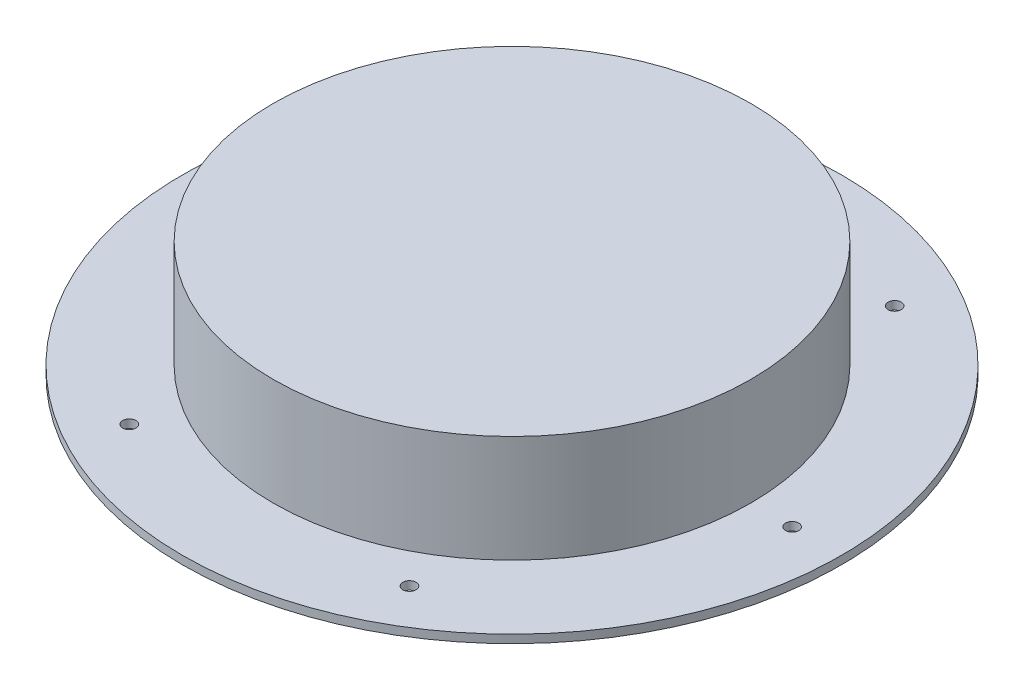
ISO-10303-21;
HEADER;
FILE_DESCRIPTION(('STEP AP214'),'2;1');
FILE_NAME('part.step','',(''),(''),'','','');
FILE_SCHEMA(('AUTOMOTIVE_DESIGN { 1 0 10303 214 1 1 1 1 }'));
ENDSEC;
DATA;
#1=APPLICATION_CONTEXT('core data for automotive mechanical design processes');
#2=APPLICATION_PROTOCOL_DEFINITION('international standard','automotive_design',2000,#1);
#3=PRODUCT_CONTEXT('',#1,'mechanical');
#4=PRODUCT('Part','Part','',(#3));
#5=PRODUCT_RELATED_PRODUCT_CATEGORY('part','',(#4));
#6=PRODUCT_DEFINITION_FORMATION('','',#4);
#7=PRODUCT_DEFINITION_CONTEXT('part definition',#1,'design');
#8=PRODUCT_DEFINITION('design','',#6,#7);
#9=PRODUCT_DEFINITION_SHAPE('','',#8);
#10=(LENGTH_UNIT() NAMED_UNIT(*) SI_UNIT(.MILLI.,.METRE.));
#11=(NAMED_UNIT(*) PLANE_ANGLE_UNIT() SI_UNIT($,.RADIAN.));
#12=(NAMED_UNIT(*) SI_UNIT($,.STERADIAN.) SOLID_ANGLE_UNIT());
#13=UNCERTAINTY_MEASURE_WITH_UNIT(LENGTH_MEASURE(1.E-05),#10,'distance_accuracy_value','');
#14=(GEOMETRIC_REPRESENTATION_CONTEXT(3) GLOBAL_UNCERTAINTY_ASSIGNED_CONTEXT((#13)) GLOBAL_UNIT_ASSIGNED_CONTEXT((#10,
#11,#12)) REPRESENTATION_CONTEXT('',''));
#15=CARTESIAN_POINT('',(0.,0.,0.));
#16=DIRECTION('',(0.,0.,1.));
#17=DIRECTION('',(1.,0.,0.));
#18=AXIS2_PLACEMENT_3D('',#15,#16,#17);
#19=CARTESIAN_POINT('',(0.,2.5,0.));
#20=DIRECTION('',(0.,1.,0.));
#21=DIRECTION('',(0.,0.,1.));
#22=AXIS2_PLACEMENT_3D('',#19,#20,#21);
#23=PLANE('',#22);
#24=CARTESIAN_POINT('',(85.,2.5,0.));
#25=DIRECTION('',(0.,1.,0.));
#26=DIRECTION('',(0.,0.,1.));
#27=AXIS2_PLACEMENT_3D('',#24,#25,#26);
#28=CIRCLE('',#27,2.);
#29=CARTESIAN_POINT('',(85.,2.5,2.));
#30=VERTEX_POINT('',#29);
#31=EDGE_CURVE('E158',#30,#30,#28,.T.);
#32=ORIENTED_EDGE('',*,*,#31,.F.);
#33=EDGE_LOOP('',(#32));
#34=FACE_BOUND('',#33,.T.);
#35=CARTESIAN_POINT('',(42.5000000000009,2.5,-73.6121593216768));
#36=DIRECTION('',(0.,1.,0.));
#37=DIRECTION('',(0.,0.,1.));
#38=AXIS2_PLACEMENT_3D('',#35,#36,#37);
#39=CIRCLE('',#38,1.99999999999999);
#40=CARTESIAN_POINT('',(42.5000000000009,2.5,-71.6121593216768));
#41=VERTEX_POINT('',#40);
#42=EDGE_CURVE('E319',#41,#41,#39,.T.);
#43=ORIENTED_EDGE('',*,*,#42,.F.);
#44=EDGE_LOOP('',(#43));
#45=FACE_BOUND('',#44,.T.);
#46=CARTESIAN_POINT('',(42.4999999999998,2.5,73.6121593216774));
#47=DIRECTION('',(0.,1.,0.));
#48=DIRECTION('',(0.,0.,1.));
#49=AXIS2_PLACEMENT_3D('',#46,#47,#48);
#50=CIRCLE('',#49,1.99999999999999);
#51=CARTESIAN_POINT('',(42.4999999999998,2.5,75.6121593216774));
#52=VERTEX_POINT('',#51);
#53=EDGE_CURVE('E316',#52,#52,#50,.T.);
#54=ORIENTED_EDGE('',*,*,#53,.F.);
#55=EDGE_LOOP('',(#54));
#56=FACE_BOUND('',#55,.T.);
#57=CARTESIAN_POINT('',(-42.5000000000003,2.5,73.6121593216771));
#58=DIRECTION('',(0.,1.,0.));
#59=DIRECTION('',(0.,0.,1.));
#60=AXIS2_PLACEMENT_3D('',#57,#58,#59);
#61=CIRCLE('',#60,1.99999999999999);
#62=CARTESIAN_POINT('',(-42.5000000000003,2.5,75.6121593216771));
#63=VERTEX_POINT('',#62);
#64=EDGE_CURVE('E307',#63,#63,#61,.T.);
#65=ORIENTED_EDGE('',*,*,#64,.F.);
#66=EDGE_LOOP('',(#65));
#67=FACE_BOUND('',#66,.T.);
#68=CARTESIAN_POINT('',(-42.4999999999993,2.5,-73.6121593216777));
#69=DIRECTION('',(0.,1.,0.));
#70=DIRECTION('',(0.,0.,1.));
#71=AXIS2_PLACEMENT_3D('',#68,#69,#70);
#72=CIRCLE('',#71,2.);
#73=CARTESIAN_POINT('',(-42.4999999999993,2.5,-71.6121593216777));
#74=VERTEX_POINT('',#73);
#75=EDGE_CURVE('E301',#74,#74,#72,.T.);
#76=ORIENTED_EDGE('',*,*,#75,.F.);
#77=EDGE_LOOP('',(#76));
#78=FACE_BOUND('',#77,.T.);
#79=CARTESIAN_POINT('',(-85.,2.5,-5.93551827603333E-13));
#80=DIRECTION('',(0.,1.,0.));
#81=DIRECTION('',(0.,0.,1.));
#82=AXIS2_PLACEMENT_3D('',#79,#80,#81);
#83=CIRCLE('',#82,1.99999999999999);
#84=CARTESIAN_POINT('',(-85.,2.5,1.9999999999994));
#85=VERTEX_POINT('',#84);
#86=EDGE_CURVE('E296',#85,#85,#83,.T.);
#87=ORIENTED_EDGE('',*,*,#86,.F.);
#88=EDGE_LOOP('',(#87));
#89=FACE_BOUND('',#88,.T.);
#90=CARTESIAN_POINT('',(0.,2.5,0.));
#91=DIRECTION('',(0.,1.,0.));
#92=DIRECTION('',(0.,0.,1.));
#93=AXIS2_PLACEMENT_3D('',#90,#91,#92);
#94=CIRCLE('',#93,100.);
#95=CARTESIAN_POINT('',(0.,2.5,100.));
#96=VERTEX_POINT('',#95);
#97=EDGE_CURVE('E11',#96,#96,#94,.T.);
#98=ORIENTED_EDGE('',*,*,#97,.T.);
#99=EDGE_LOOP('',(#98));
#100=FACE_BOUND('',#99,.T.);
#101=CARTESIAN_POINT('',(0.,2.5,0.));
#102=DIRECTION('',(0.,1.,0.));
#103=DIRECTION('',(0.,0.,1.));
#104=AXIS2_PLACEMENT_3D('',#101,#102,#103);
#105=CIRCLE('',#104,72.5);
#106=CARTESIAN_POINT('',(0.,2.5,72.5));
#107=VERTEX_POINT('',#106);
#108=EDGE_CURVE('E261',#107,#107,#105,.T.);
#109=ORIENTED_EDGE('',*,*,#108,.F.);
#110=EDGE_LOOP('',(#109));
#111=FACE_BOUND('',#110,.T.);
#112=ADVANCED_FACE('F45',(#34,#45,#56,#67,#78,#89,#100,#111),#23,.T.);
#113=CARTESIAN_POINT('',(0.,0.,0.));
#114=DIRECTION('',(0.,1.,0.));
#115=DIRECTION('',(0.,0.,1.));
#116=AXIS2_PLACEMENT_3D('',#113,#114,#115);
#117=PLANE('',#116);
#118=CARTESIAN_POINT('',(85.,0.,0.));
#119=DIRECTION('',(0.,1.,0.));
#120=DIRECTION('',(0.,0.,1.));
#121=AXIS2_PLACEMENT_3D('',#118,#119,#120);
#122=CIRCLE('',#121,2.);
#123=CARTESIAN_POINT('',(85.,0.,2.));
#124=VERTEX_POINT('',#123);
#125=EDGE_CURVE('E278',#124,#124,#122,.T.);
#126=ORIENTED_EDGE('',*,*,#125,.T.);
#127=EDGE_LOOP('',(#126));
#128=FACE_BOUND('',#127,.T.);
#129=CARTESIAN_POINT('',(-32.4999999999995,0.,-56.2916512459888));
#130=DIRECTION('',(0.,1.,0.));
#131=DIRECTION('',(0.,0.,1.));
#132=AXIS2_PLACEMENT_3D('',#129,#130,#131);
#133=CIRCLE('',#132,2.);
#134=CARTESIAN_POINT('',(-32.4999999999995,0.,-54.2916512459888));
#135=VERTEX_POINT('',#134);
#136=EDGE_CURVE('E383',#135,#135,#133,.T.);
#137=ORIENTED_EDGE('',*,*,#136,.T.);
#138=EDGE_LOOP('',(#137));
#139=FACE_BOUND('',#138,.T.);
#140=CARTESIAN_POINT('',(42.5000000000009,0.,-73.6121593216768));
#141=DIRECTION('',(0.,1.,0.));
#142=DIRECTION('',(0.,0.,1.));
#143=AXIS2_PLACEMENT_3D('',#140,#141,#142);
#144=CIRCLE('',#143,1.99999999999999);
#145=CARTESIAN_POINT('',(42.5000000000009,0.,-71.6121593216768));
#146=VERTEX_POINT('',#145);
#147=EDGE_CURVE('E387',#146,#146,#144,.T.);
#148=ORIENTED_EDGE('',*,*,#147,.T.);
#149=EDGE_LOOP('',(#148));
#150=FACE_BOUND('',#149,.T.);
#151=CARTESIAN_POINT('',(32.5000000000007,0.,-56.2916512459881));
#152=DIRECTION('',(0.,1.,0.));
#153=DIRECTION('',(0.,0.,1.));
#154=AXIS2_PLACEMENT_3D('',#151,#152,#153);
#155=CIRCLE('',#154,1.99999999999999);
#156=CARTESIAN_POINT('',(32.5000000000007,0.,-54.2916512459882));
#157=VERTEX_POINT('',#156);
#158=EDGE_CURVE('E391',#157,#157,#155,.T.);
#159=ORIENTED_EDGE('',*,*,#158,.T.);
#160=EDGE_LOOP('',(#159));
#161=FACE_BOUND('',#160,.T.);
#162=CARTESIAN_POINT('',(65.,0.,0.));
#163=DIRECTION('',(0.,1.,0.));
#164=DIRECTION('',(0.,0.,1.));
#165=AXIS2_PLACEMENT_3D('',#162,#163,#164);
#166=CIRCLE('',#165,2.);
#167=CARTESIAN_POINT('',(65.,0.,2.));
#168=VERTEX_POINT('',#167);
#169=EDGE_CURVE('E395',#168,#168,#166,.T.);
#170=ORIENTED_EDGE('',*,*,#169,.T.);
#171=EDGE_LOOP('',(#170));
#172=FACE_BOUND('',#171,.T.);
#173=CARTESIAN_POINT('',(42.4999999999998,0.,73.6121593216774));
#174=DIRECTION('',(0.,1.,0.));
#175=DIRECTION('',(0.,0.,1.));
#176=AXIS2_PLACEMENT_3D('',#173,#174,#175);
#177=CIRCLE('',#176,1.99999999999999);
#178=CARTESIAN_POINT('',(42.4999999999998,0.,75.6121593216774));
#179=VERTEX_POINT('',#178);
#180=EDGE_CURVE('E399',#179,#179,#177,.T.);
#181=ORIENTED_EDGE('',*,*,#180,.T.);
#182=EDGE_LOOP('',(#181));
#183=FACE_BOUND('',#182,.T.);
#184=CARTESIAN_POINT('',(32.4999999999999,0.,56.2916512459886));
#185=DIRECTION('',(0.,1.,0.));
#186=DIRECTION('',(0.,0.,1.));
#187=AXIS2_PLACEMENT_3D('',#184,#185,#186);
#188=CIRCLE('',#187,2.);
#189=CARTESIAN_POINT('',(32.4999999999999,0.,58.2916512459886));
#190=VERTEX_POINT('',#189);
#191=EDGE_CURVE('E403',#190,#190,#188,.T.);
#192=ORIENTED_EDGE('',*,*,#191,.T.);
#193=EDGE_LOOP('',(#192));
#194=FACE_BOUND('',#193,.T.);
#195=CARTESIAN_POINT('',(-42.5000000000003,0.,73.6121593216771));
#196=DIRECTION('',(0.,1.,0.));
#197=DIRECTION('',(0.,0.,1.));
#198=AXIS2_PLACEMENT_3D('',#195,#196,#197);
#199=CIRCLE('',#198,1.99999999999999);
#200=CARTESIAN_POINT('',(-42.5000000000003,0.,75.6121593216771));
#201=VERTEX_POINT('',#200);
#202=EDGE_CURVE('E310',#201,#201,#199,.T.);
#203=ORIENTED_EDGE('',*,*,#202,.T.);
#204=EDGE_LOOP('',(#203));
#205=FACE_BOUND('',#204,.T.);
#206=CARTESIAN_POINT('',(-42.4999999999993,0.,-73.6121593216777));
#207=DIRECTION('',(0.,1.,0.));
#208=DIRECTION('',(0.,0.,1.));
#209=AXIS2_PLACEMENT_3D('',#206,#207,#208);
#210=CIRCLE('',#209,2.);
#211=CARTESIAN_POINT('',(-42.4999999999993,0.,-71.6121593216777));
#212=VERTEX_POINT('',#211);
#213=EDGE_CURVE('E410',#212,#212,#210,.T.);
#214=ORIENTED_EDGE('',*,*,#213,.T.);
#215=EDGE_LOOP('',(#214));
#216=FACE_BOUND('',#215,.T.);
#217=CARTESIAN_POINT('',(-65.,0.,-4.53892574049607E-13));
#218=DIRECTION('',(0.,1.,0.));
#219=DIRECTION('',(0.,0.,1.));
#220=AXIS2_PLACEMENT_3D('',#217,#218,#219);
#221=CIRCLE('',#220,1.99999999999999);
#222=CARTESIAN_POINT('',(-65.,0.,1.99999999999954));
#223=VERTEX_POINT('',#222);
#224=EDGE_CURVE('E414',#223,#223,#221,.T.);
#225=ORIENTED_EDGE('',*,*,#224,.T.);
#226=EDGE_LOOP('',(#225));
#227=FACE_BOUND('',#226,.T.);
#228=CARTESIAN_POINT('',(-85.,0.,-5.93551827603333E-13));
#229=DIRECTION('',(0.,1.,0.));
#230=DIRECTION('',(0.,0.,1.));
#231=AXIS2_PLACEMENT_3D('',#228,#229,#230);
#232=CIRCLE('',#231,1.99999999999999);
#233=CARTESIAN_POINT('',(-85.,0.,1.9999999999994));
#234=VERTEX_POINT('',#233);
#235=EDGE_CURVE('E418',#234,#234,#232,.T.);
#236=ORIENTED_EDGE('',*,*,#235,.T.);
#237=EDGE_LOOP('',(#236));
#238=FACE_BOUND('',#237,.T.);
#239=CARTESIAN_POINT('',(-32.5000000000003,0.,56.2916512459884));
#240=DIRECTION('',(0.,1.,0.));
#241=DIRECTION('',(0.,0.,1.));
#242=AXIS2_PLACEMENT_3D('',#239,#240,#241);
#243=CIRCLE('',#242,2.);
#244=CARTESIAN_POINT('',(-32.5000000000003,0.,58.2916512459884));
#245=VERTEX_POINT('',#244);
#246=EDGE_CURVE('E422',#245,#245,#243,.T.);
#247=ORIENTED_EDGE('',*,*,#246,.T.);
#248=EDGE_LOOP('',(#247));
#249=FACE_BOUND('',#248,.T.);
#250=CARTESIAN_POINT('',(0.,0.,0.));
#251=DIRECTION('',(0.,1.,0.));
#252=DIRECTION('',(0.,0.,1.));
#253=AXIS2_PLACEMENT_3D('',#250,#251,#252);
#254=CIRCLE('',#253,100.);
#255=CARTESIAN_POINT('',(0.,0.,100.));
#256=VERTEX_POINT('',#255);
#257=EDGE_CURVE('E55',#256,#256,#254,.T.);
#258=ORIENTED_EDGE('',*,*,#257,.F.);
#259=EDGE_LOOP('',(#258));
#260=FACE_BOUND('',#259,.T.);
#261=CARTESIAN_POINT('',(0.,0.,0.));
#262=DIRECTION('',(0.,1.,0.));
#263=DIRECTION('',(0.,0.,1.));
#264=AXIS2_PLACEMENT_3D('',#261,#262,#263);
#265=CIRCLE('',#264,70.);
#266=CARTESIAN_POINT('',(69.2857142857143,0.,-9.97445717412062));
#267=VERTEX_POINT('',#266);
#268=CARTESIAN_POINT('',(43.2809904446054,0.,-55.0159601037188));
#269=VERTEX_POINT('',#268);
#270=EDGE_CURVE('E266',#267,#269,#265,.T.);
#271=ORIENTED_EDGE('',*,*,#270,.T.);
#272=CARTESIAN_POINT('',(34.9999999999999,0.,-60.6217782649108));
#273=DIRECTION('',(0.,-1.,0.));
#274=DIRECTION('',(0.,0.,-1.));
#275=AXIS2_PLACEMENT_3D('',#272,#273,#274);
#276=CIRCLE('',#275,9.99999999999995);
#277=CARTESIAN_POINT('',(26.0047238411086,0.,-64.9904172778393));
#278=VERTEX_POINT('',#277);
#279=EDGE_CURVE('E63',#269,#278,#276,.T.);
#280=ORIENTED_EDGE('',*,*,#279,.T.);
#281=CARTESIAN_POINT('',(-26.0047238411091,0.,-64.9904172778392));
#282=VERTEX_POINT('',#281);
#283=EDGE_CURVE('E268',#278,#282,#265,.T.);
#284=ORIENTED_EDGE('',*,*,#283,.T.);
#285=CARTESIAN_POINT('',(-35.0000000000003,0.,-60.6217782649106));
#286=DIRECTION('',(0.,-1.,0.));
#287=DIRECTION('',(0.,0.,-1.));
#288=AXIS2_PLACEMENT_3D('',#285,#286,#287);
#289=CIRCLE('',#288,9.99999999999995);
#290=CARTESIAN_POINT('',(-43.2809904446058,0.,-55.0159601037185));
#291=VERTEX_POINT('',#290);
#292=EDGE_CURVE('E69',#282,#291,#289,.T.);
#293=ORIENTED_EDGE('',*,*,#292,.T.);
#294=CARTESIAN_POINT('',(-69.2857142857144,0.,-9.97445717412014));
#295=VERTEX_POINT('',#294);
#296=EDGE_CURVE('E746',#291,#295,#265,.T.);
#297=ORIENTED_EDGE('',*,*,#296,.T.);
#298=CARTESIAN_POINT('',(-70.,0.,4.88807387438039E-13));
#299=DIRECTION('',(0.,-1.,0.));
#300=DIRECTION('',(0.,0.,-1.));
#301=AXIS2_PLACEMENT_3D('',#298,#299,#300);
#302=CIRCLE('',#301,9.99999999999995);
#303=CARTESIAN_POINT('',(-69.2857142857142,0.,9.9744571741211));
#304=VERTEX_POINT('',#303);
#305=EDGE_CURVE('E178',#295,#304,#302,.T.);
#306=ORIENTED_EDGE('',*,*,#305,.T.);
#307=CARTESIAN_POINT('',(-43.2809904446051,0.,55.0159601037191));
#308=VERTEX_POINT('',#307);
#309=EDGE_CURVE('E750',#304,#308,#265,.T.);
#310=ORIENTED_EDGE('',*,*,#309,.T.);
#311=CARTESIAN_POINT('',(-34.9999999999995,0.,60.621778264911));
#312=DIRECTION('',(0.,-1.,0.));
#313=DIRECTION('',(0.,0.,-1.));
#314=AXIS2_PLACEMENT_3D('',#311,#312,#313);
#315=CIRCLE('',#314,9.99999999999995);
#316=CARTESIAN_POINT('',(-26.0047238411082,0.,64.9904172778395));
#317=VERTEX_POINT('',#316);
#318=EDGE_CURVE('E196',#308,#317,#315,.T.);
#319=ORIENTED_EDGE('',*,*,#318,.T.);
#320=CARTESIAN_POINT('',(26.0047238411095,0.,64.990417277839));
#321=VERTEX_POINT('',#320);
#322=EDGE_CURVE('E753',#317,#321,#265,.T.);
#323=ORIENTED_EDGE('',*,*,#322,.T.);
#324=CARTESIAN_POINT('',(35.0000000000007,0.,60.6217782649103));
#325=DIRECTION('',(0.,-1.,0.));
#326=DIRECTION('',(0.,0.,-1.));
#327=AXIS2_PLACEMENT_3D('',#324,#325,#326);
#328=CIRCLE('',#327,9.99999999999995);
#329=CARTESIAN_POINT('',(43.2809904446062,0.,55.0159601037182));
#330=VERTEX_POINT('',#329);
#331=EDGE_CURVE('E214',#321,#330,#328,.T.);
#332=ORIENTED_EDGE('',*,*,#331,.T.);
#333=CARTESIAN_POINT('',(69.2857142857143,0.,9.97445717412062));
#334=VERTEX_POINT('',#333);
#335=EDGE_CURVE('E265',#330,#334,#265,.T.);
#336=ORIENTED_EDGE('',*,*,#335,.T.);
#337=CARTESIAN_POINT('',(70.,0.,0.));
#338=DIRECTION('',(0.,-1.,0.));
#339=DIRECTION('',(0.,0.,-1.));
#340=AXIS2_PLACEMENT_3D('',#337,#338,#339);
#341=CIRCLE('',#340,9.99999999999995);
#342=EDGE_CURVE('E232',#334,#267,#341,.T.);
#343=ORIENTED_EDGE('',*,*,#342,.T.);
#344=EDGE_LOOP('',(#271,#280,#284,#293,#297,#306,#310,#319,#323,#332,#336,#343));
#345=FACE_BOUND('',#344,.T.);
#346=ADVANCED_FACE('F333',(#128,#139,#150,#161,#172,#183,#194,#205,#216,#227,#238,#249,#260,
#345),#117,.F.);
#347=CARTESIAN_POINT('',(0.,2.5,0.));
#348=DIRECTION('',(0.,-1.,0.));
#349=DIRECTION('',(0.,0.,-1.));
#350=AXIS2_PLACEMENT_3D('',#347,#348,#349);
#351=CYLINDRICAL_SURFACE('',#350,100.);
#352=ORIENTED_EDGE('',*,*,#97,.F.);
#353=EDGE_LOOP('',(#352));
#354=FACE_BOUND('',#353,.T.);
#355=ORIENTED_EDGE('',*,*,#257,.T.);
#356=EDGE_LOOP('',(#355));
#357=FACE_BOUND('',#356,.T.);
#358=ADVANCED_FACE('F47',(#354,#357),#351,.T.);
#359=CARTESIAN_POINT('',(0.,2.5,0.));
#360=DIRECTION('',(0.,-1.,0.));
#361=DIRECTION('',(0.,0.,-1.));
#362=AXIS2_PLACEMENT_3D('',#359,#360,#361);
#363=CYLINDRICAL_SURFACE('',#362,70.);
#364=DIRECTION('',(0.,-1.,0.));
#365=VECTOR('',#364,1.);
#366=CARTESIAN_POINT('',(43.2809904446054,5.,-55.0159601037188));
#367=LINE('',#366,#365);
#368=CARTESIAN_POINT('',(43.2809904446054,5.,-55.0159601037188));
#369=VERTEX_POINT('',#368);
#370=EDGE_CURVE('E136',#369,#269,#367,.T.);
#371=ORIENTED_EDGE('',*,*,#370,.T.);
#372=ORIENTED_EDGE('',*,*,#270,.F.);
#373=DIRECTION('',(0.,-1.,0.));
#374=VECTOR('',#373,1.);
#375=CARTESIAN_POINT('',(69.2857142857143,5.,-9.97445717412062));
#376=LINE('',#375,#374);
#377=CARTESIAN_POINT('',(69.2857142857143,5.,-9.97445717412062));
#378=VERTEX_POINT('',#377);
#379=EDGE_CURVE('E246',#378,#267,#376,.T.);
#380=ORIENTED_EDGE('',*,*,#379,.F.);
#381=CARTESIAN_POINT('',(0.,5.,0.));
#382=DIRECTION('',(0.,-1.,0.));
#383=DIRECTION('',(0.,0.,-1.));
#384=AXIS2_PLACEMENT_3D('',#381,#382,#383);
#385=CIRCLE('',#384,70.);
#386=CARTESIAN_POINT('',(69.2857142857143,5.,9.97445717412062));
#387=VERTEX_POINT('',#386);
#388=EDGE_CURVE('E236',#387,#378,#385,.F.);
#389=ORIENTED_EDGE('',*,*,#388,.F.);
#390=DIRECTION('',(0.,-1.,0.));
#391=VECTOR('',#390,1.);
#392=CARTESIAN_POINT('',(69.2857142857143,5.,9.97445717412062));
#393=LINE('',#392,#391);
#394=EDGE_CURVE('E243',#387,#334,#393,.T.);
#395=ORIENTED_EDGE('',*,*,#394,.T.);
#396=ORIENTED_EDGE('',*,*,#335,.F.);
#397=DIRECTION('',(0.,-1.,0.));
#398=VECTOR('',#397,1.);
#399=CARTESIAN_POINT('',(43.2809904446062,5.,55.0159601037182));
#400=LINE('',#399,#398);
#401=CARTESIAN_POINT('',(43.2809904446062,5.,55.0159601037182));
#402=VERTEX_POINT('',#401);
#403=EDGE_CURVE('E228',#402,#330,#400,.T.);
#404=ORIENTED_EDGE('',*,*,#403,.F.);
#405=CARTESIAN_POINT('',(0.,5.,0.));
#406=DIRECTION('',(0.,-1.,0.));
#407=DIRECTION('',(0.,0.,-1.));
#408=AXIS2_PLACEMENT_3D('',#405,#406,#407);
#409=CIRCLE('',#408,70.);
#410=CARTESIAN_POINT('',(26.0047238411095,5.,64.990417277839));
#411=VERTEX_POINT('',#410);
#412=EDGE_CURVE('E218',#411,#402,#409,.F.);
#413=ORIENTED_EDGE('',*,*,#412,.F.);
#414=DIRECTION('',(0.,-1.,0.));
#415=VECTOR('',#414,1.);
#416=CARTESIAN_POINT('',(26.0047238411095,5.,64.990417277839));
#417=LINE('',#416,#415);
#418=EDGE_CURVE('E225',#411,#321,#417,.T.);
#419=ORIENTED_EDGE('',*,*,#418,.T.);
#420=ORIENTED_EDGE('',*,*,#322,.F.);
#421=DIRECTION('',(0.,-1.,0.));
#422=VECTOR('',#421,1.);
#423=CARTESIAN_POINT('',(-26.0047238411082,5.,64.9904172778395));
#424=LINE('',#423,#422);
#425=CARTESIAN_POINT('',(-26.0047238411082,5.,64.9904172778395));
#426=VERTEX_POINT('',#425);
#427=EDGE_CURVE('E210',#426,#317,#424,.T.);
#428=ORIENTED_EDGE('',*,*,#427,.F.);
#429=CARTESIAN_POINT('',(0.,5.,0.));
#430=DIRECTION('',(0.,-1.,0.));
#431=DIRECTION('',(0.,0.,-1.));
#432=AXIS2_PLACEMENT_3D('',#429,#430,#431);
#433=CIRCLE('',#432,70.);
#434=CARTESIAN_POINT('',(-43.2809904446051,5.,55.0159601037191));
#435=VERTEX_POINT('',#434);
#436=EDGE_CURVE('E200',#435,#426,#433,.F.);
#437=ORIENTED_EDGE('',*,*,#436,.F.);
#438=DIRECTION('',(0.,-1.,0.));
#439=VECTOR('',#438,1.);
#440=CARTESIAN_POINT('',(-43.2809904446051,5.,55.0159601037191));
#441=LINE('',#440,#439);
#442=EDGE_CURVE('E207',#435,#308,#441,.T.);
#443=ORIENTED_EDGE('',*,*,#442,.T.);
#444=ORIENTED_EDGE('',*,*,#309,.F.);
#445=DIRECTION('',(0.,-1.,0.));
#446=VECTOR('',#445,1.);
#447=CARTESIAN_POINT('',(-69.2857142857142,5.,9.9744571741211));
#448=LINE('',#447,#446);
#449=CARTESIAN_POINT('',(-69.2857142857142,5.,9.9744571741211));
#450=VERTEX_POINT('',#449);
#451=EDGE_CURVE('E192',#450,#304,#448,.T.);
#452=ORIENTED_EDGE('',*,*,#451,.F.);
#453=CARTESIAN_POINT('',(0.,5.,0.));
#454=DIRECTION('',(0.,-1.,0.));
#455=DIRECTION('',(0.,0.,-1.));
#456=AXIS2_PLACEMENT_3D('',#453,#454,#455);
#457=CIRCLE('',#456,70.);
#458=CARTESIAN_POINT('',(-69.2857142857144,5.,-9.97445717412014));
#459=VERTEX_POINT('',#458);
#460=EDGE_CURVE('E182',#459,#450,#457,.F.);
#461=ORIENTED_EDGE('',*,*,#460,.F.);
#462=DIRECTION('',(0.,-1.,0.));
#463=VECTOR('',#462,1.);
#464=CARTESIAN_POINT('',(-69.2857142857144,5.,-9.97445717412014));
#465=LINE('',#464,#463);
#466=EDGE_CURVE('E189',#459,#295,#465,.T.);
#467=ORIENTED_EDGE('',*,*,#466,.T.);
#468=ORIENTED_EDGE('',*,*,#296,.F.);
#469=DIRECTION('',(0.,-1.,0.));
#470=VECTOR('',#469,1.);
#471=CARTESIAN_POINT('',(-43.2809904446058,5.,-55.0159601037185));
#472=LINE('',#471,#470);
#473=CARTESIAN_POINT('',(-43.2809904446058,5.,-55.0159601037185));
#474=VERTEX_POINT('',#473);
#475=EDGE_CURVE('E175',#474,#291,#472,.T.);
#476=ORIENTED_EDGE('',*,*,#475,.F.);
#477=CARTESIAN_POINT('',(0.,5.,0.));
#478=DIRECTION('',(0.,-1.,0.));
#479=DIRECTION('',(0.,0.,-1.));
#480=AXIS2_PLACEMENT_3D('',#477,#478,#479);
#481=CIRCLE('',#480,70.);
#482=CARTESIAN_POINT('',(-26.0047238411091,5.,-64.9904172778392));
#483=VERTEX_POINT('',#482);
#484=EDGE_CURVE('E165',#483,#474,#481,.F.);
#485=ORIENTED_EDGE('',*,*,#484,.F.);
#486=DIRECTION('',(0.,-1.,0.));
#487=VECTOR('',#486,1.);
#488=CARTESIAN_POINT('',(-26.0047238411091,5.,-64.9904172778392));
#489=LINE('',#488,#487);
#490=EDGE_CURVE('E172',#483,#282,#489,.T.);
#491=ORIENTED_EDGE('',*,*,#490,.T.);
#492=ORIENTED_EDGE('',*,*,#283,.F.);
#493=DIRECTION('',(0.,-1.,0.));
#494=VECTOR('',#493,1.);
#495=CARTESIAN_POINT('',(26.0047238411086,5.,-64.9904172778393));
#496=LINE('',#495,#494);
#497=CARTESIAN_POINT('',(26.0047238411086,5.,-64.9904172778393));
#498=VERTEX_POINT('',#497);
#499=EDGE_CURVE('E145',#498,#278,#496,.T.);
#500=ORIENTED_EDGE('',*,*,#499,.F.);
#501=CARTESIAN_POINT('',(0.,5.,0.));
#502=DIRECTION('',(0.,-1.,0.));
#503=DIRECTION('',(0.,0.,-1.));
#504=AXIS2_PLACEMENT_3D('',#501,#502,#503);
#505=CIRCLE('',#504,70.);
#506=EDGE_CURVE('E149',#369,#498,#505,.F.);
#507=ORIENTED_EDGE('',*,*,#506,.F.);
#508=EDGE_LOOP('',(#371,#372,#380,#389,#395,#396,#404,#413,#419,#420,#428,#437,#443,#444,#452,
#461,#467,#468,#476,#485,#491,#492,#500,#507));
#509=FACE_BOUND('',#508,.T.);
#510=CARTESIAN_POINT('',(0.,32.5,0.));
#511=DIRECTION('',(0.,1.,0.));
#512=DIRECTION('',(0.,0.,1.));
#513=AXIS2_PLACEMENT_3D('',#510,#511,#512);
#514=CIRCLE('',#513,70.);
#515=CARTESIAN_POINT('',(0.,32.5,70.));
#516=VERTEX_POINT('',#515);
#517=EDGE_CURVE('E257',#516,#516,#514,.T.);
#518=ORIENTED_EDGE('',*,*,#517,.T.);
#519=EDGE_LOOP('',(#518));
#520=FACE_BOUND('',#519,.T.);
#521=ADVANCED_FACE('F152',(#509,#520),#363,.F.);
#522=CARTESIAN_POINT('',(0.,32.5,0.));
#523=DIRECTION('',(0.,-1.,0.));
#524=DIRECTION('',(0.,0.,-1.));
#525=AXIS2_PLACEMENT_3D('',#522,#523,#524);
#526=CYLINDRICAL_SURFACE('',#525,72.5);
#527=ORIENTED_EDGE('',*,*,#108,.T.);
#528=EDGE_LOOP('',(#527));
#529=FACE_BOUND('',#528,.T.);
#530=CARTESIAN_POINT('',(0.,35.,0.));
#531=DIRECTION('',(0.,1.,0.));
#532=DIRECTION('',(0.,0.,1.));
#533=AXIS2_PLACEMENT_3D('',#530,#531,#532);
#534=CIRCLE('',#533,72.5);
#535=CARTESIAN_POINT('',(0.,35.,72.5));
#536=VERTEX_POINT('',#535);
#537=EDGE_CURVE('E250',#536,#536,#534,.T.);
#538=ORIENTED_EDGE('',*,*,#537,.F.);
#539=EDGE_LOOP('',(#538));
#540=FACE_BOUND('',#539,.T.);
#541=ADVANCED_FACE('F347',(#529,#540),#526,.T.);
#542=CARTESIAN_POINT('',(0.,32.5,0.));
#543=DIRECTION('',(0.,1.,0.));
#544=DIRECTION('',(0.,0.,1.));
#545=AXIS2_PLACEMENT_3D('',#542,#543,#544);
#546=PLANE('',#545);
#547=ORIENTED_EDGE('',*,*,#517,.F.);
#548=EDGE_LOOP('',(#547));
#549=FACE_BOUND('',#548,.T.);
#550=ADVANCED_FACE('F350',(#549),#546,.F.);
#551=CARTESIAN_POINT('',(0.,35.,0.));
#552=DIRECTION('',(0.,1.,0.));
#553=DIRECTION('',(0.,0.,1.));
#554=AXIS2_PLACEMENT_3D('',#551,#552,#553);
#555=PLANE('',#554);
#556=ORIENTED_EDGE('',*,*,#537,.T.);
#557=EDGE_LOOP('',(#556));
#558=FACE_BOUND('',#557,.T.);
#559=ADVANCED_FACE('F354',(#558),#555,.T.);
#560=CARTESIAN_POINT('',(70.,5.,0.));
#561=DIRECTION('',(0.,-1.,0.));
#562=DIRECTION('',(0.,0.,-1.));
#563=AXIS2_PLACEMENT_3D('',#560,#561,#562);
#564=CYLINDRICAL_SURFACE('',#563,9.99999999999995);
#565=ORIENTED_EDGE('',*,*,#342,.F.);
#566=ORIENTED_EDGE('',*,*,#394,.F.);
#567=CARTESIAN_POINT('',(70.,5.,0.));
#568=DIRECTION('',(0.,-1.,0.));
#569=DIRECTION('',(0.,0.,-1.));
#570=AXIS2_PLACEMENT_3D('',#567,#568,#569);
#571=CIRCLE('',#570,9.99999999999995);
#572=EDGE_CURVE('E239',#387,#378,#571,.T.);
#573=ORIENTED_EDGE('',*,*,#572,.T.);
#574=ORIENTED_EDGE('',*,*,#379,.T.);
#575=EDGE_LOOP('',(#565,#566,#573,#574));
#576=FACE_BOUND('',#575,.T.);
#577=ADVANCED_FACE('F356',(#576),#564,.T.);
#578=CARTESIAN_POINT('',(0.,5.,0.));
#579=DIRECTION('',(0.,-1.,0.));
#580=DIRECTION('',(0.,0.,-1.));
#581=AXIS2_PLACEMENT_3D('',#578,#579,#580);
#582=PLANE('',#581);
#583=CARTESIAN_POINT('',(65.,5.,0.));
#584=DIRECTION('',(0.,-1.,0.));
#585=DIRECTION('',(0.,0.,-1.));
#586=AXIS2_PLACEMENT_3D('',#583,#584,#585);
#587=CIRCLE('',#586,2.);
#588=CARTESIAN_POINT('',(65.,5.,-2.));
#589=VERTEX_POINT('',#588);
#590=EDGE_CURVE('E49',#589,#589,#587,.T.);
#591=ORIENTED_EDGE('',*,*,#590,.T.);
#592=EDGE_LOOP('',(#591));
#593=FACE_BOUND('',#592,.T.);
#594=ORIENTED_EDGE('',*,*,#388,.T.);
#595=ORIENTED_EDGE('',*,*,#572,.F.);
#596=EDGE_LOOP('',(#594,#595));
#597=FACE_BOUND('',#596,.T.);
#598=ADVANCED_FACE('F363',(#593,#597),#582,.F.);
#599=CARTESIAN_POINT('',(35.0000000000007,5.,60.6217782649103));
#600=DIRECTION('',(0.,-1.,0.));
#601=DIRECTION('',(0.,0.,-1.));
#602=AXIS2_PLACEMENT_3D('',#599,#600,#601);
#603=CYLINDRICAL_SURFACE('',#602,9.99999999999995);
#604=ORIENTED_EDGE('',*,*,#331,.F.);
#605=ORIENTED_EDGE('',*,*,#418,.F.);
#606=CARTESIAN_POINT('',(35.0000000000007,5.,60.6217782649103));
#607=DIRECTION('',(0.,-1.,0.));
#608=DIRECTION('',(0.,0.,-1.));
#609=AXIS2_PLACEMENT_3D('',#606,#607,#608);
#610=CIRCLE('',#609,9.99999999999995);
#611=EDGE_CURVE('E221',#411,#402,#610,.T.);
#612=ORIENTED_EDGE('',*,*,#611,.T.);
#613=ORIENTED_EDGE('',*,*,#403,.T.);
#614=EDGE_LOOP('',(#604,#605,#612,#613));
#615=FACE_BOUND('',#614,.T.);
#616=ADVANCED_FACE('F429',(#615),#603,.T.);
#617=CARTESIAN_POINT('',(0.,5.,0.));
#618=DIRECTION('',(0.,-1.,0.));
#619=DIRECTION('',(0.,0.,-1.));
#620=AXIS2_PLACEMENT_3D('',#617,#618,#619);
#621=PLANE('',#620);
#622=CARTESIAN_POINT('',(32.4999999999999,5.,56.2916512459886));
#623=DIRECTION('',(0.,-1.,0.));
#624=DIRECTION('',(0.,0.,-1.));
#625=AXIS2_PLACEMENT_3D('',#622,#623,#624);
#626=CIRCLE('',#625,2.);
#627=CARTESIAN_POINT('',(32.4999999999999,5.,54.2916512459886));
#628=VERTEX_POINT('',#627);
#629=EDGE_CURVE('E289',#628,#628,#626,.T.);
#630=ORIENTED_EDGE('',*,*,#629,.T.);
#631=EDGE_LOOP('',(#630));
#632=FACE_BOUND('',#631,.T.);
#633=ORIENTED_EDGE('',*,*,#412,.T.);
#634=ORIENTED_EDGE('',*,*,#611,.F.);
#635=EDGE_LOOP('',(#633,#634));
#636=FACE_BOUND('',#635,.T.);
#637=ADVANCED_FACE('F434',(#632,#636),#621,.F.);
#638=CARTESIAN_POINT('',(-34.9999999999995,5.,60.621778264911));
#639=DIRECTION('',(0.,-1.,0.));
#640=DIRECTION('',(0.,0.,-1.));
#641=AXIS2_PLACEMENT_3D('',#638,#639,#640);
#642=CYLINDRICAL_SURFACE('',#641,9.99999999999995);
#643=ORIENTED_EDGE('',*,*,#318,.F.);
#644=ORIENTED_EDGE('',*,*,#442,.F.);
#645=CARTESIAN_POINT('',(-34.9999999999995,5.,60.621778264911));
#646=DIRECTION('',(0.,-1.,0.));
#647=DIRECTION('',(0.,0.,-1.));
#648=AXIS2_PLACEMENT_3D('',#645,#646,#647);
#649=CIRCLE('',#648,9.99999999999995);
#650=EDGE_CURVE('E203',#435,#426,#649,.T.);
#651=ORIENTED_EDGE('',*,*,#650,.T.);
#652=ORIENTED_EDGE('',*,*,#427,.T.);
#653=EDGE_LOOP('',(#643,#644,#651,#652));
#654=FACE_BOUND('',#653,.T.);
#655=ADVANCED_FACE('F439',(#654),#642,.T.);
#656=CARTESIAN_POINT('',(0.,5.,0.));
#657=DIRECTION('',(0.,-1.,0.));
#658=DIRECTION('',(0.,0.,-1.));
#659=AXIS2_PLACEMENT_3D('',#656,#657,#658);
#660=PLANE('',#659);
#661=CARTESIAN_POINT('',(-32.5000000000003,5.,56.2916512459884));
#662=DIRECTION('',(0.,-1.,0.));
#663=DIRECTION('',(0.,0.,-1.));
#664=AXIS2_PLACEMENT_3D('',#661,#662,#663);
#665=CIRCLE('',#664,2.);
#666=CARTESIAN_POINT('',(-32.5000000000003,5.,54.2916512459884));
#667=VERTEX_POINT('',#666);
#668=EDGE_CURVE('E286',#667,#667,#665,.T.);
#669=ORIENTED_EDGE('',*,*,#668,.T.);
#670=EDGE_LOOP('',(#669));
#671=FACE_BOUND('',#670,.T.);
#672=ORIENTED_EDGE('',*,*,#436,.T.);
#673=ORIENTED_EDGE('',*,*,#650,.F.);
#674=EDGE_LOOP('',(#672,#673));
#675=FACE_BOUND('',#674,.T.);
#676=ADVANCED_FACE('F442',(#671,#675),#660,.F.);
#677=CARTESIAN_POINT('',(-70.,5.,4.88807387438039E-13));
#678=DIRECTION('',(0.,-1.,0.));
#679=DIRECTION('',(0.,0.,-1.));
#680=AXIS2_PLACEMENT_3D('',#677,#678,#679);
#681=CYLINDRICAL_SURFACE('',#680,9.99999999999995);
#682=ORIENTED_EDGE('',*,*,#305,.F.);
#683=ORIENTED_EDGE('',*,*,#466,.F.);
#684=CARTESIAN_POINT('',(-70.,5.,4.88807387438039E-13));
#685=DIRECTION('',(0.,-1.,0.));
#686=DIRECTION('',(0.,0.,-1.));
#687=AXIS2_PLACEMENT_3D('',#684,#685,#686);
#688=CIRCLE('',#687,9.99999999999995);
#689=EDGE_CURVE('E185',#459,#450,#688,.T.);
#690=ORIENTED_EDGE('',*,*,#689,.T.);
#691=ORIENTED_EDGE('',*,*,#451,.T.);
#692=EDGE_LOOP('',(#682,#683,#690,#691));
#693=FACE_BOUND('',#692,.T.);
#694=ADVANCED_FACE('F446',(#693),#681,.T.);
#695=CARTESIAN_POINT('',(0.,5.,0.));
#696=DIRECTION('',(0.,-1.,0.));
#697=DIRECTION('',(0.,0.,-1.));
#698=AXIS2_PLACEMENT_3D('',#695,#696,#697);
#699=PLANE('',#698);
#700=CARTESIAN_POINT('',(-65.,5.,-4.53892574049607E-13));
#701=DIRECTION('',(0.,-1.,0.));
#702=DIRECTION('',(0.,0.,-1.));
#703=AXIS2_PLACEMENT_3D('',#700,#701,#702);
#704=CIRCLE('',#703,1.99999999999999);
#705=CARTESIAN_POINT('',(-65.,5.,-2.00000000000045));
#706=VERTEX_POINT('',#705);
#707=EDGE_CURVE('E282',#706,#706,#704,.T.);
#708=ORIENTED_EDGE('',*,*,#707,.T.);
#709=EDGE_LOOP('',(#708));
#710=FACE_BOUND('',#709,.T.);
#711=ORIENTED_EDGE('',*,*,#460,.T.);
#712=ORIENTED_EDGE('',*,*,#689,.F.);
#713=EDGE_LOOP('',(#711,#712));
#714=FACE_BOUND('',#713,.T.);
#715=ADVANCED_FACE('F450',(#710,#714),#699,.F.);
#716=CARTESIAN_POINT('',(-35.0000000000003,5.,-60.6217782649106));
#717=DIRECTION('',(0.,-1.,0.));
#718=DIRECTION('',(0.,0.,-1.));
#719=AXIS2_PLACEMENT_3D('',#716,#717,#718);
#720=CYLINDRICAL_SURFACE('',#719,9.99999999999995);
#721=ORIENTED_EDGE('',*,*,#292,.F.);
#722=ORIENTED_EDGE('',*,*,#490,.F.);
#723=CARTESIAN_POINT('',(-35.0000000000003,5.,-60.6217782649106));
#724=DIRECTION('',(0.,-1.,0.));
#725=DIRECTION('',(0.,0.,-1.));
#726=AXIS2_PLACEMENT_3D('',#723,#724,#725);
#727=CIRCLE('',#726,9.99999999999995);
#728=EDGE_CURVE('E168',#483,#474,#727,.T.);
#729=ORIENTED_EDGE('',*,*,#728,.T.);
#730=ORIENTED_EDGE('',*,*,#475,.T.);
#731=EDGE_LOOP('',(#721,#722,#729,#730));
#732=FACE_BOUND('',#731,.T.);
#733=ADVANCED_FACE('F454',(#732),#720,.T.);
#734=CARTESIAN_POINT('',(0.,5.,0.));
#735=DIRECTION('',(0.,-1.,0.));
#736=DIRECTION('',(0.,0.,-1.));
#737=AXIS2_PLACEMENT_3D('',#734,#735,#736);
#738=PLANE('',#737);
#739=CARTESIAN_POINT('',(-32.4999999999995,5.,-56.2916512459888));
#740=DIRECTION('',(0.,-1.,0.));
#741=DIRECTION('',(0.,0.,-1.));
#742=AXIS2_PLACEMENT_3D('',#739,#740,#741);
#743=CIRCLE('',#742,2.);
#744=CARTESIAN_POINT('',(-32.4999999999995,5.,-58.2916512459888));
#745=VERTEX_POINT('',#744);
#746=EDGE_CURVE('E277',#745,#745,#743,.T.);
#747=ORIENTED_EDGE('',*,*,#746,.T.);
#748=EDGE_LOOP('',(#747));
#749=FACE_BOUND('',#748,.T.);
#750=ORIENTED_EDGE('',*,*,#484,.T.);
#751=ORIENTED_EDGE('',*,*,#728,.F.);
#752=EDGE_LOOP('',(#750,#751));
#753=FACE_BOUND('',#752,.T.);
#754=ADVANCED_FACE('F458',(#749,#753),#738,.F.);
#755=CARTESIAN_POINT('',(34.9999999999999,5.,-60.6217782649108));
#756=DIRECTION('',(0.,-1.,0.));
#757=DIRECTION('',(0.,0.,-1.));
#758=AXIS2_PLACEMENT_3D('',#755,#756,#757);
#759=CYLINDRICAL_SURFACE('',#758,9.99999999999995);
#760=ORIENTED_EDGE('',*,*,#279,.F.);
#761=ORIENTED_EDGE('',*,*,#370,.F.);
#762=CARTESIAN_POINT('',(34.9999999999999,5.,-60.6217782649108));
#763=DIRECTION('',(0.,-1.,0.));
#764=DIRECTION('',(0.,0.,-1.));
#765=AXIS2_PLACEMENT_3D('',#762,#763,#764);
#766=CIRCLE('',#765,9.99999999999995);
#767=EDGE_CURVE('E139',#369,#498,#766,.T.);
#768=ORIENTED_EDGE('',*,*,#767,.T.);
#769=ORIENTED_EDGE('',*,*,#499,.T.);
#770=EDGE_LOOP('',(#760,#761,#768,#769));
#771=FACE_BOUND('',#770,.T.);
#772=ADVANCED_FACE('F138',(#771),#759,.T.);
#773=CARTESIAN_POINT('',(0.,5.,0.));
#774=DIRECTION('',(0.,-1.,0.));
#775=DIRECTION('',(0.,0.,-1.));
#776=AXIS2_PLACEMENT_3D('',#773,#774,#775);
#777=PLANE('',#776);
#778=CARTESIAN_POINT('',(32.5000000000007,5.,-56.2916512459881));
#779=DIRECTION('',(0.,-1.,0.));
#780=DIRECTION('',(0.,0.,-1.));
#781=AXIS2_PLACEMENT_3D('',#778,#779,#780);
#782=CIRCLE('',#781,1.99999999999999);
#783=CARTESIAN_POINT('',(32.5000000000007,5.,-58.2916512459881));
#784=VERTEX_POINT('',#783);
#785=EDGE_CURVE('E273',#784,#784,#782,.T.);
#786=ORIENTED_EDGE('',*,*,#785,.T.);
#787=EDGE_LOOP('',(#786));
#788=FACE_BOUND('',#787,.T.);
#789=ORIENTED_EDGE('',*,*,#506,.T.);
#790=ORIENTED_EDGE('',*,*,#767,.F.);
#791=EDGE_LOOP('',(#789,#790));
#792=FACE_BOUND('',#791,.T.);
#793=ADVANCED_FACE('F148',(#788,#792),#777,.F.);
#794=CARTESIAN_POINT('',(32.5000000000007,0.,-56.2916512459881));
#795=DIRECTION('',(0.,1.,0.));
#796=DIRECTION('',(0.,0.,1.));
#797=AXIS2_PLACEMENT_3D('',#794,#795,#796);
#798=CYLINDRICAL_SURFACE('',#797,1.99999999999999);
#799=ORIENTED_EDGE('',*,*,#158,.F.);
#800=EDGE_LOOP('',(#799));
#801=FACE_BOUND('',#800,.T.);
#802=ORIENTED_EDGE('',*,*,#785,.F.);
#803=EDGE_LOOP('',(#802));
#804=FACE_BOUND('',#803,.T.);
#805=ADVANCED_FACE('F467',(#801,#804),#798,.F.);
#806=CARTESIAN_POINT('',(-32.4999999999995,0.,-56.2916512459888));
#807=DIRECTION('',(0.,1.,0.));
#808=DIRECTION('',(0.,0.,1.));
#809=AXIS2_PLACEMENT_3D('',#806,#807,#808);
#810=CYLINDRICAL_SURFACE('',#809,2.);
#811=ORIENTED_EDGE('',*,*,#136,.F.);
#812=EDGE_LOOP('',(#811));
#813=FACE_BOUND('',#812,.T.);
#814=ORIENTED_EDGE('',*,*,#746,.F.);
#815=EDGE_LOOP('',(#814));
#816=FACE_BOUND('',#815,.T.);
#817=ADVANCED_FACE('F500',(#813,#816),#810,.F.);
#818=CARTESIAN_POINT('',(-65.,0.,-4.53892574049607E-13));
#819=DIRECTION('',(0.,1.,0.));
#820=DIRECTION('',(0.,0.,1.));
#821=AXIS2_PLACEMENT_3D('',#818,#819,#820);
#822=CYLINDRICAL_SURFACE('',#821,1.99999999999999);
#823=ORIENTED_EDGE('',*,*,#224,.F.);
#824=EDGE_LOOP('',(#823));
#825=FACE_BOUND('',#824,.T.);
#826=ORIENTED_EDGE('',*,*,#707,.F.);
#827=EDGE_LOOP('',(#826));
#828=FACE_BOUND('',#827,.T.);
#829=ADVANCED_FACE('F493',(#825,#828),#822,.F.);
#830=CARTESIAN_POINT('',(-32.5000000000003,0.,56.2916512459884));
#831=DIRECTION('',(0.,1.,0.));
#832=DIRECTION('',(0.,0.,1.));
#833=AXIS2_PLACEMENT_3D('',#830,#831,#832);
#834=CYLINDRICAL_SURFACE('',#833,2.);
#835=ORIENTED_EDGE('',*,*,#246,.F.);
#836=EDGE_LOOP('',(#835));
#837=FACE_BOUND('',#836,.T.);
#838=ORIENTED_EDGE('',*,*,#668,.F.);
#839=EDGE_LOOP('',(#838));
#840=FACE_BOUND('',#839,.T.);
#841=ADVANCED_FACE('F479',(#837,#840),#834,.F.);
#842=CARTESIAN_POINT('',(32.4999999999999,0.,56.2916512459886));
#843=DIRECTION('',(0.,1.,0.));
#844=DIRECTION('',(0.,0.,1.));
#845=AXIS2_PLACEMENT_3D('',#842,#843,#844);
#846=CYLINDRICAL_SURFACE('',#845,2.);
#847=ORIENTED_EDGE('',*,*,#191,.F.);
#848=EDGE_LOOP('',(#847));
#849=FACE_BOUND('',#848,.T.);
#850=ORIENTED_EDGE('',*,*,#629,.F.);
#851=EDGE_LOOP('',(#850));
#852=FACE_BOUND('',#851,.T.);
#853=ADVANCED_FACE('F475',(#849,#852),#846,.F.);
#854=CARTESIAN_POINT('',(65.,0.,0.));
#855=DIRECTION('',(0.,1.,0.));
#856=DIRECTION('',(0.,0.,1.));
#857=AXIS2_PLACEMENT_3D('',#854,#855,#856);
#858=CYLINDRICAL_SURFACE('',#857,2.);
#859=ORIENTED_EDGE('',*,*,#169,.F.);
#860=EDGE_LOOP('',(#859));
#861=FACE_BOUND('',#860,.T.);
#862=ORIENTED_EDGE('',*,*,#590,.F.);
#863=EDGE_LOOP('',(#862));
#864=FACE_BOUND('',#863,.T.);
#865=ADVANCED_FACE('F478',(#861,#864),#858,.F.);
#866=CARTESIAN_POINT('',(-85.,0.,-5.93551827603333E-13));
#867=DIRECTION('',(0.,1.,0.));
#868=DIRECTION('',(0.,0.,1.));
#869=AXIS2_PLACEMENT_3D('',#866,#867,#868);
#870=CYLINDRICAL_SURFACE('',#869,1.99999999999999);
#871=ORIENTED_EDGE('',*,*,#86,.T.);
#872=EDGE_LOOP('',(#871));
#873=FACE_BOUND('',#872,.T.);
#874=ORIENTED_EDGE('',*,*,#235,.F.);
#875=EDGE_LOOP('',(#874));
#876=FACE_BOUND('',#875,.T.);
#877=ADVANCED_FACE('F487',(#873,#876),#870,.F.);
#878=CARTESIAN_POINT('',(-42.4999999999993,0.,-73.6121593216777));
#879=DIRECTION('',(0.,1.,0.));
#880=DIRECTION('',(0.,0.,1.));
#881=AXIS2_PLACEMENT_3D('',#878,#879,#880);
#882=CYLINDRICAL_SURFACE('',#881,2.);
#883=ORIENTED_EDGE('',*,*,#75,.T.);
#884=EDGE_LOOP('',(#883));
#885=FACE_BOUND('',#884,.T.);
#886=ORIENTED_EDGE('',*,*,#213,.F.);
#887=EDGE_LOOP('',(#886));
#888=FACE_BOUND('',#887,.T.);
#889=ADVANCED_FACE('F473',(#885,#888),#882,.F.);
#890=CARTESIAN_POINT('',(-42.5000000000003,0.,73.6121593216771));
#891=DIRECTION('',(0.,1.,0.));
#892=DIRECTION('',(0.,0.,1.));
#893=AXIS2_PLACEMENT_3D('',#890,#891,#892);
#894=CYLINDRICAL_SURFACE('',#893,1.99999999999999);
#895=ORIENTED_EDGE('',*,*,#64,.T.);
#896=EDGE_LOOP('',(#895));
#897=FACE_BOUND('',#896,.T.);
#898=ORIENTED_EDGE('',*,*,#202,.F.);
#899=EDGE_LOOP('',(#898));
#900=FACE_BOUND('',#899,.T.);
#901=ADVANCED_FACE('F469',(#897,#900),#894,.F.);
#902=CARTESIAN_POINT('',(42.4999999999998,0.,73.6121593216774));
#903=DIRECTION('',(0.,1.,0.));
#904=DIRECTION('',(0.,0.,1.));
#905=AXIS2_PLACEMENT_3D('',#902,#903,#904);
#906=CYLINDRICAL_SURFACE('',#905,1.99999999999999);
#907=ORIENTED_EDGE('',*,*,#53,.T.);
#908=EDGE_LOOP('',(#907));
#909=FACE_BOUND('',#908,.T.);
#910=ORIENTED_EDGE('',*,*,#180,.F.);
#911=EDGE_LOOP('',(#910));
#912=FACE_BOUND('',#911,.T.);
#913=ADVANCED_FACE('F472',(#909,#912),#906,.F.);
#914=CARTESIAN_POINT('',(42.5000000000009,0.,-73.6121593216768));
#915=DIRECTION('',(0.,1.,0.));
#916=DIRECTION('',(0.,0.,1.));
#917=AXIS2_PLACEMENT_3D('',#914,#915,#916);
#918=CYLINDRICAL_SURFACE('',#917,1.99999999999999);
#919=ORIENTED_EDGE('',*,*,#42,.T.);
#920=EDGE_LOOP('',(#919));
#921=FACE_BOUND('',#920,.T.);
#922=ORIENTED_EDGE('',*,*,#147,.F.);
#923=EDGE_LOOP('',(#922));
#924=FACE_BOUND('',#923,.T.);
#925=ADVANCED_FACE('F483',(#921,#924),#918,.F.);
#926=CARTESIAN_POINT('',(85.,0.,0.));
#927=DIRECTION('',(0.,1.,0.));
#928=DIRECTION('',(0.,0.,1.));
#929=AXIS2_PLACEMENT_3D('',#926,#927,#928);
#930=CYLINDRICAL_SURFACE('',#929,2.);
#931=ORIENTED_EDGE('',*,*,#31,.T.);
#932=EDGE_LOOP('',(#931));
#933=FACE_BOUND('',#932,.T.);
#934=ORIENTED_EDGE('',*,*,#125,.F.);
#935=EDGE_LOOP('',(#934));
#936=FACE_BOUND('',#935,.T.);
#937=ADVANCED_FACE('F328',(#933,#936),#930,.F.);
#938=CLOSED_SHELL('',(#112,#346,#358,#521,#541,#550,#559,#577,#598,#616,#637,#655,#676,#694,
#715,#733,#754,#772,#793,#805,#817,#829,#841,#853,#865,#877,#889,#901,#913,#925,#937));
#939=MANIFOLD_SOLID_BREP('B2',#938);
#940=ADVANCED_BREP_SHAPE_REPRESENTATION('',(#18,#939),#14);
#941=SHAPE_DEFINITION_REPRESENTATION(#9,#940);
ENDSEC;
END-ISO-10303-21;
